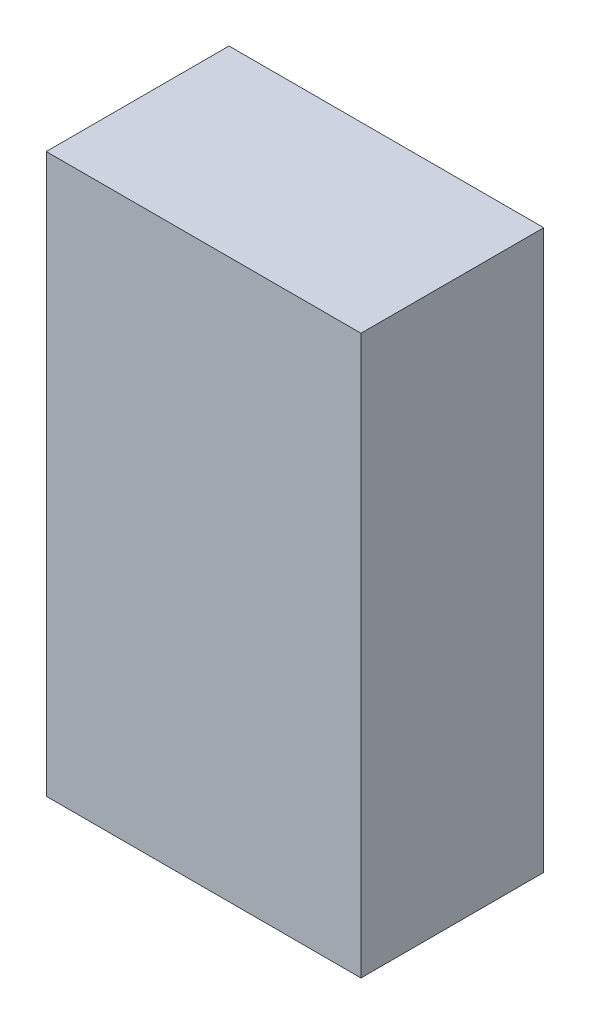
ISO-10303-21;
HEADER;
FILE_DESCRIPTION(('STEP AP214'),'2;1');
FILE_NAME('part.step','',(''),(''),'','','');
FILE_SCHEMA(('AUTOMOTIVE_DESIGN { 1 0 10303 214 1 1 1 1 }'));
ENDSEC;
DATA;
#1=APPLICATION_CONTEXT('core data for automotive mechanical design processes');
#2=APPLICATION_PROTOCOL_DEFINITION('international standard','automotive_design',2000,#1);
#3=PRODUCT_CONTEXT('',#1,'mechanical');
#4=PRODUCT('Part','Part','',(#3));
#5=PRODUCT_RELATED_PRODUCT_CATEGORY('part','',(#4));
#6=PRODUCT_DEFINITION_FORMATION('','',#4);
#7=PRODUCT_DEFINITION_CONTEXT('part definition',#1,'design');
#8=PRODUCT_DEFINITION('design','',#6,#7);
#9=PRODUCT_DEFINITION_SHAPE('','',#8);
#10=(LENGTH_UNIT() NAMED_UNIT(*) SI_UNIT(.MILLI.,.METRE.));
#11=(NAMED_UNIT(*) PLANE_ANGLE_UNIT() SI_UNIT($,.RADIAN.));
#12=(NAMED_UNIT(*) SI_UNIT($,.STERADIAN.) SOLID_ANGLE_UNIT());
#13=UNCERTAINTY_MEASURE_WITH_UNIT(LENGTH_MEASURE(1.E-05),#10,'distance_accuracy_value','');
#14=(GEOMETRIC_REPRESENTATION_CONTEXT(3) GLOBAL_UNCERTAINTY_ASSIGNED_CONTEXT((#13)) GLOBAL_UNIT_ASSIGNED_CONTEXT((#10,
#11,#12)) REPRESENTATION_CONTEXT('',''));
#15=CARTESIAN_POINT('',(0.,0.,0.));
#16=DIRECTION('',(0.,0.,1.));
#17=DIRECTION('',(1.,0.,0.));
#18=AXIS2_PLACEMENT_3D('',#15,#16,#17);
#19=CARTESIAN_POINT('',(-15.5,55.,-8.99999999999993));
#20=DIRECTION('',(1.,0.,0.));
#21=DIRECTION('',(0.,0.,-1.));
#22=AXIS2_PLACEMENT_3D('',#19,#20,#21);
#23=PLANE('',#22);
#24=DIRECTION('',(0.,0.,1.));
#25=VECTOR('',#24,1.);
#26=CARTESIAN_POINT('',(-15.5,0.,-8.99999999999993));
#27=LINE('',#26,#25);
#28=CARTESIAN_POINT('',(-15.5,0.,-8.99999999999993));
#29=VERTEX_POINT('',#28);
#30=CARTESIAN_POINT('',(-15.5,0.,9.00000000000004));
#31=VERTEX_POINT('',#30);
#32=EDGE_CURVE('E96',#29,#31,#27,.T.);
#33=ORIENTED_EDGE('',*,*,#32,.T.);
#34=DIRECTION('',(0.,-1.,0.));
#35=VECTOR('',#34,1.);
#36=CARTESIAN_POINT('',(-15.5,55.,9.00000000000004));
#37=LINE('',#36,#35);
#38=CARTESIAN_POINT('',(-15.5,55.,9.00000000000004));
#39=VERTEX_POINT('',#38);
#40=EDGE_CURVE('E11',#39,#31,#37,.T.);
#41=ORIENTED_EDGE('',*,*,#40,.F.);
#42=DIRECTION('',(0.,0.,1.));
#43=VECTOR('',#42,1.);
#44=CARTESIAN_POINT('',(-15.5,55.,-8.99999999999993));
#45=LINE('',#44,#43);
#46=CARTESIAN_POINT('',(-15.5,55.,-8.99999999999993));
#47=VERTEX_POINT('',#46);
#48=EDGE_CURVE('E84',#47,#39,#45,.T.);
#49=ORIENTED_EDGE('',*,*,#48,.F.);
#50=DIRECTION('',(0.,-1.,0.));
#51=VECTOR('',#50,1.);
#52=CARTESIAN_POINT('',(-15.5,55.,-8.99999999999993));
#53=LINE('',#52,#51);
#54=EDGE_CURVE('E92',#47,#29,#53,.T.);
#55=ORIENTED_EDGE('',*,*,#54,.T.);
#56=EDGE_LOOP('',(#33,#41,#49,#55));
#57=FACE_BOUND('',#56,.T.);
#58=ADVANCED_FACE('F33',(#57),#23,.F.);
#59=CARTESIAN_POINT('',(-15.5,55.,9.00000000000004));
#60=DIRECTION('',(0.,0.,-1.));
#61=DIRECTION('',(-1.,0.,0.));
#62=AXIS2_PLACEMENT_3D('',#59,#60,#61);
#63=PLANE('',#62);
#64=DIRECTION('',(1.,0.,0.));
#65=VECTOR('',#64,1.);
#66=CARTESIAN_POINT('',(-15.5,0.,9.00000000000004));
#67=LINE('',#66,#65);
#68=CARTESIAN_POINT('',(15.5,0.,9.00000000000004));
#69=VERTEX_POINT('',#68);
#70=EDGE_CURVE('E88',#31,#69,#67,.T.);
#71=ORIENTED_EDGE('',*,*,#70,.T.);
#72=DIRECTION('',(0.,-1.,0.));
#73=VECTOR('',#72,1.);
#74=CARTESIAN_POINT('',(15.5,55.,9.00000000000004));
#75=LINE('',#74,#73);
#76=CARTESIAN_POINT('',(15.5,55.,9.00000000000004));
#77=VERTEX_POINT('',#76);
#78=EDGE_CURVE('E41',#77,#69,#75,.T.);
#79=ORIENTED_EDGE('',*,*,#78,.F.);
#80=DIRECTION('',(1.,0.,0.));
#81=VECTOR('',#80,1.);
#82=CARTESIAN_POINT('',(-15.5,55.,9.00000000000004));
#83=LINE('',#82,#81);
#84=EDGE_CURVE('E79',#39,#77,#83,.T.);
#85=ORIENTED_EDGE('',*,*,#84,.F.);
#86=ORIENTED_EDGE('',*,*,#40,.T.);
#87=EDGE_LOOP('',(#71,#79,#85,#86));
#88=FACE_BOUND('',#87,.T.);
#89=ADVANCED_FACE('F87',(#88),#63,.F.);
#90=CARTESIAN_POINT('',(15.5,55.,-8.99999999999993));
#91=DIRECTION('',(-1.,0.,0.));
#92=DIRECTION('',(0.,0.,1.));
#93=AXIS2_PLACEMENT_3D('',#90,#91,#92);
#94=PLANE('',#93);
#95=DIRECTION('',(0.,0.,-1.));
#96=VECTOR('',#95,1.);
#97=CARTESIAN_POINT('',(15.5,0.,-8.99999999999993));
#98=LINE('',#97,#96);
#99=CARTESIAN_POINT('',(15.5,0.,-8.99999999999993));
#100=VERTEX_POINT('',#99);
#101=EDGE_CURVE('E66',#69,#100,#98,.T.);
#102=ORIENTED_EDGE('',*,*,#101,.T.);
#103=DIRECTION('',(0.,-1.,0.));
#104=VECTOR('',#103,1.);
#105=CARTESIAN_POINT('',(15.5,55.,-8.99999999999993));
#106=LINE('',#105,#104);
#107=CARTESIAN_POINT('',(15.5,55.,-8.99999999999993));
#108=VERTEX_POINT('',#107);
#109=EDGE_CURVE('E89',#108,#100,#106,.T.);
#110=ORIENTED_EDGE('',*,*,#109,.F.);
#111=DIRECTION('',(0.,0.,-1.));
#112=VECTOR('',#111,1.);
#113=CARTESIAN_POINT('',(15.5,55.,-8.99999999999993));
#114=LINE('',#113,#112);
#115=EDGE_CURVE('E82',#77,#108,#114,.T.);
#116=ORIENTED_EDGE('',*,*,#115,.F.);
#117=ORIENTED_EDGE('',*,*,#78,.T.);
#118=EDGE_LOOP('',(#102,#110,#116,#117));
#119=FACE_BOUND('',#118,.T.);
#120=ADVANCED_FACE('F90',(#119),#94,.F.);
#121=CARTESIAN_POINT('',(-15.5,55.,-8.99999999999993));
#122=DIRECTION('',(0.,0.,1.));
#123=DIRECTION('',(1.,0.,0.));
#124=AXIS2_PLACEMENT_3D('',#121,#122,#123);
#125=PLANE('',#124);
#126=DIRECTION('',(-1.,0.,0.));
#127=VECTOR('',#126,1.);
#128=CARTESIAN_POINT('',(-15.5,0.,-8.99999999999993));
#129=LINE('',#128,#127);
#130=EDGE_CURVE('E72',#100,#29,#129,.T.);
#131=ORIENTED_EDGE('',*,*,#130,.T.);
#132=ORIENTED_EDGE('',*,*,#54,.F.);
#133=DIRECTION('',(-1.,0.,0.));
#134=VECTOR('',#133,1.);
#135=CARTESIAN_POINT('',(-15.5,55.,-8.99999999999993));
#136=LINE('',#135,#134);
#137=EDGE_CURVE('E49',#108,#47,#136,.T.);
#138=ORIENTED_EDGE('',*,*,#137,.F.);
#139=ORIENTED_EDGE('',*,*,#109,.T.);
#140=EDGE_LOOP('',(#131,#132,#138,#139));
#141=FACE_BOUND('',#140,.T.);
#142=ADVANCED_FACE('F103',(#141),#125,.F.);
#143=CARTESIAN_POINT('',(0.,55.,0.));
#144=DIRECTION('',(0.,1.,0.));
#145=DIRECTION('',(0.,0.,1.));
#146=AXIS2_PLACEMENT_3D('',#143,#144,#145);
#147=PLANE('',#146);
#148=ORIENTED_EDGE('',*,*,#48,.T.);
#149=ORIENTED_EDGE('',*,*,#84,.T.);
#150=ORIENTED_EDGE('',*,*,#115,.T.);
#151=ORIENTED_EDGE('',*,*,#137,.T.);
#152=EDGE_LOOP('',(#148,#149,#150,#151));
#153=FACE_BOUND('',#152,.T.);
#154=ADVANCED_FACE('F80',(#153),#147,.T.);
#155=CARTESIAN_POINT('',(0.,0.,0.));
#156=DIRECTION('',(0.,1.,0.));
#157=DIRECTION('',(0.,0.,1.));
#158=AXIS2_PLACEMENT_3D('',#155,#156,#157);
#159=PLANE('',#158);
#160=ORIENTED_EDGE('',*,*,#32,.F.);
#161=ORIENTED_EDGE('',*,*,#130,.F.);
#162=ORIENTED_EDGE('',*,*,#101,.F.);
#163=ORIENTED_EDGE('',*,*,#70,.F.);
#164=EDGE_LOOP('',(#160,#161,#162,#163));
#165=FACE_BOUND('',#164,.T.);
#166=ADVANCED_FACE('F106',(#165),#159,.F.);
#167=CLOSED_SHELL('',(#58,#89,#120,#142,#154,#166));
#168=MANIFOLD_SOLID_BREP('B2',#167);
#169=ADVANCED_BREP_SHAPE_REPRESENTATION('',(#18,#168),#14);
#170=SHAPE_DEFINITION_REPRESENTATION(#9,#169);
ENDSEC;
END-ISO-10303-21;
